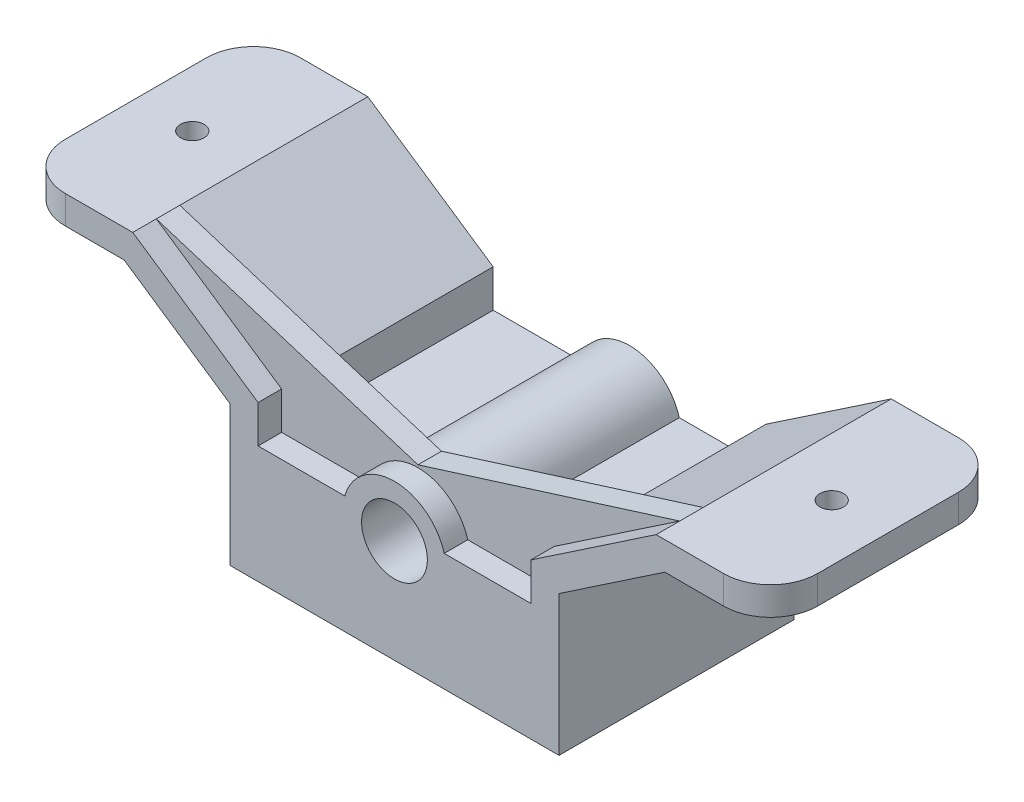
ISO-10303-21;
HEADER;
FILE_DESCRIPTION(('STEP AP214'),'2;1');
FILE_NAME('part.step','',(''),(''),'','','');
FILE_SCHEMA(('AUTOMOTIVE_DESIGN { 1 0 10303 214 1 1 1 1 }'));
ENDSEC;
DATA;
#1=APPLICATION_CONTEXT('core data for automotive mechanical design processes');
#2=APPLICATION_PROTOCOL_DEFINITION('international standard','automotive_design',2000,#1);
#3=PRODUCT_CONTEXT('',#1,'mechanical');
#4=PRODUCT('Part','Part','',(#3));
#5=PRODUCT_RELATED_PRODUCT_CATEGORY('part','',(#4));
#6=PRODUCT_DEFINITION_FORMATION('','',#4);
#7=PRODUCT_DEFINITION_CONTEXT('part definition',#1,'design');
#8=PRODUCT_DEFINITION('design','',#6,#7);
#9=PRODUCT_DEFINITION_SHAPE('','',#8);
#10=(LENGTH_UNIT() NAMED_UNIT(*) SI_UNIT(.MILLI.,.METRE.));
#11=(NAMED_UNIT(*) PLANE_ANGLE_UNIT() SI_UNIT($,.RADIAN.));
#12=(NAMED_UNIT(*) SI_UNIT($,.STERADIAN.) SOLID_ANGLE_UNIT());
#13=UNCERTAINTY_MEASURE_WITH_UNIT(LENGTH_MEASURE(1.E-05),#10,'distance_accuracy_value','');
#14=(GEOMETRIC_REPRESENTATION_CONTEXT(3) GLOBAL_UNCERTAINTY_ASSIGNED_CONTEXT((#13)) GLOBAL_UNIT_ASSIGNED_CONTEXT((#10,
#11,#12)) REPRESENTATION_CONTEXT('',''));
#15=CARTESIAN_POINT('',(0.,0.,0.));
#16=DIRECTION('',(0.,0.,1.));
#17=DIRECTION('',(1.,0.,0.));
#18=AXIS2_PLACEMENT_3D('',#15,#16,#17);
#19=CARTESIAN_POINT('',(55.664377375765,51.,25.));
#20=DIRECTION('',(0.55950585253942,-0.828826399781122,0.));
#21=DIRECTION('',(0.828826399781122,0.55950585253942,0.));
#22=AXIS2_PLACEMENT_3D('',#19,#20,#21);
#23=PLANE('',#22);
#24=DIRECTION('',(0.828826399781122,0.55950585253942,0.));
#25=VECTOR('',#24,1.);
#26=CARTESIAN_POINT('',(55.664377375765,51.,15.));
#27=LINE('',#26,#25);
#28=CARTESIAN_POINT('',(29.,33.,15.));
#29=VERTEX_POINT('',#28);
#30=CARTESIAN_POINT('',(55.664377375765,51.,15.));
#31=VERTEX_POINT('',#30);
#32=EDGE_CURVE('E260',#29,#31,#27,.T.);
#33=ORIENTED_EDGE('',*,*,#32,.T.);
#34=DIRECTION('',(0.,0.,-1.));
#35=VECTOR('',#34,1.);
#36=CARTESIAN_POINT('',(55.664377375765,51.,25.));
#37=LINE('',#36,#35);
#38=CARTESIAN_POINT('',(55.664377375765,51.,-25.));
#39=VERTEX_POINT('',#38);
#40=EDGE_CURVE('E499',#31,#39,#37,.T.);
#41=ORIENTED_EDGE('',*,*,#40,.T.);
#42=DIRECTION('',(-0.828826399781122,-0.55950585253942,0.));
#43=VECTOR('',#42,1.);
#44=CARTESIAN_POINT('',(55.664377375765,51.,-25.));
#45=LINE('',#44,#43);
#46=CARTESIAN_POINT('',(29.,33.,-25.));
#47=VERTEX_POINT('',#46);
#48=EDGE_CURVE('E405',#39,#47,#45,.T.);
#49=ORIENTED_EDGE('',*,*,#48,.T.);
#50=DIRECTION('',(0.,0.,-1.));
#51=VECTOR('',#50,1.);
#52=CARTESIAN_POINT('',(29.,33.,25.));
#53=LINE('',#52,#51);
#54=EDGE_CURVE('E494',#29,#47,#53,.T.);
#55=ORIENTED_EDGE('',*,*,#54,.F.);
#56=EDGE_LOOP('',(#33,#41,#49,#55));
#57=FACE_BOUND('',#56,.T.);
#58=ADVANCED_FACE('F45',(#57),#23,.F.);
#59=CARTESIAN_POINT('',(29.,33.,25.));
#60=DIRECTION('',(1.,0.,0.));
#61=DIRECTION('',(0.,0.,-1.));
#62=AXIS2_PLACEMENT_3D('',#59,#60,#61);
#63=PLANE('',#62);
#64=DIRECTION('',(0.,1.,0.));
#65=VECTOR('',#64,1.);
#66=CARTESIAN_POINT('',(29.,33.,15.));
#67=LINE('',#66,#65);
#68=CARTESIAN_POINT('',(29.,25.,15.));
#69=VERTEX_POINT('',#68);
#70=EDGE_CURVE('E304',#69,#29,#67,.T.);
#71=ORIENTED_EDGE('',*,*,#70,.T.);
#72=ORIENTED_EDGE('',*,*,#54,.T.);
#73=DIRECTION('',(0.,-1.,0.));
#74=VECTOR('',#73,1.);
#75=CARTESIAN_POINT('',(29.,33.,-25.));
#76=LINE('',#75,#74);
#77=CARTESIAN_POINT('',(29.,25.,-25.));
#78=VERTEX_POINT('',#77);
#79=EDGE_CURVE('E409',#47,#78,#76,.T.);
#80=ORIENTED_EDGE('',*,*,#79,.T.);
#81=DIRECTION('',(0.,0.,-1.));
#82=VECTOR('',#81,1.);
#83=CARTESIAN_POINT('',(29.,25.,25.));
#84=LINE('',#83,#82);
#85=EDGE_CURVE('E489',#69,#78,#84,.T.);
#86=ORIENTED_EDGE('',*,*,#85,.F.);
#87=EDGE_LOOP('',(#71,#72,#80,#86));
#88=FACE_BOUND('',#87,.T.);
#89=ADVANCED_FACE('F682',(#88),#63,.F.);
#90=CARTESIAN_POINT('',(29.,25.,25.));
#91=DIRECTION('',(0.,-1.,0.));
#92=DIRECTION('',(0.,0.,-1.));
#93=AXIS2_PLACEMENT_3D('',#90,#91,#92);
#94=PLANE('',#93);
#95=DIRECTION('',(1.,0.,0.));
#96=VECTOR('',#95,1.);
#97=CARTESIAN_POINT('',(29.,25.,15.));
#98=LINE('',#97,#96);
#99=CARTESIAN_POINT('',(10.5830052442584,25.,15.));
#100=VERTEX_POINT('',#99);
#101=EDGE_CURVE('E300',#100,#69,#98,.T.);
#102=ORIENTED_EDGE('',*,*,#101,.T.);
#103=ORIENTED_EDGE('',*,*,#85,.T.);
#104=DIRECTION('',(-1.,0.,0.));
#105=VECTOR('',#104,1.);
#106=CARTESIAN_POINT('',(29.,25.,-25.));
#107=LINE('',#106,#105);
#108=CARTESIAN_POINT('',(10.5830052442584,25.,-25.));
#109=VERTEX_POINT('',#108);
#110=EDGE_CURVE('E413',#78,#109,#107,.T.);
#111=ORIENTED_EDGE('',*,*,#110,.T.);
#112=DIRECTION('',(0.,0.,-1.));
#113=VECTOR('',#112,1.);
#114=CARTESIAN_POINT('',(10.5830052442584,25.,25.));
#115=LINE('',#114,#113);
#116=EDGE_CURVE('E484',#100,#109,#115,.T.);
#117=ORIENTED_EDGE('',*,*,#116,.F.);
#118=EDGE_LOOP('',(#102,#103,#111,#117));
#119=FACE_BOUND('',#118,.T.);
#120=ADVANCED_FACE('F691',(#119),#94,.F.);
#121=CARTESIAN_POINT('',(0.,22.,25.));
#122=DIRECTION('',(0.,0.,-1.));
#123=DIRECTION('',(-1.,0.,0.));
#124=AXIS2_PLACEMENT_3D('',#121,#122,#123);
#125=CYLINDRICAL_SURFACE('',#124,11.);
#126=CARTESIAN_POINT('',(0.,22.,15.));
#127=DIRECTION('',(0.,0.,-1.));
#128=DIRECTION('',(1.,0.,0.));
#129=AXIS2_PLACEMENT_3D('',#126,#127,#128);
#130=CIRCLE('',#129,11.);
#131=CARTESIAN_POINT('',(-10.5830052442584,25.,15.));
#132=VERTEX_POINT('',#131);
#133=EDGE_CURVE('E296',#132,#100,#130,.T.);
#134=ORIENTED_EDGE('',*,*,#133,.T.);
#135=ORIENTED_EDGE('',*,*,#116,.T.);
#136=CARTESIAN_POINT('',(0.,22.,-25.));
#137=DIRECTION('',(0.,0.,1.));
#138=DIRECTION('',(-1.,0.,0.));
#139=AXIS2_PLACEMENT_3D('',#136,#137,#138);
#140=CIRCLE('',#139,11.);
#141=CARTESIAN_POINT('',(-10.5830052442584,25.,-25.));
#142=VERTEX_POINT('',#141);
#143=EDGE_CURVE('E417',#109,#142,#140,.T.);
#144=ORIENTED_EDGE('',*,*,#143,.T.);
#145=DIRECTION('',(0.,0.,-1.));
#146=VECTOR('',#145,1.);
#147=CARTESIAN_POINT('',(-10.5830052442584,25.,25.));
#148=LINE('',#147,#146);
#149=EDGE_CURVE('E479',#132,#142,#148,.T.);
#150=ORIENTED_EDGE('',*,*,#149,.F.);
#151=EDGE_LOOP('',(#134,#135,#144,#150));
#152=FACE_BOUND('',#151,.T.);
#153=ADVANCED_FACE('F696',(#152),#125,.T.);
#154=CARTESIAN_POINT('',(-29.,25.,25.));
#155=DIRECTION('',(0.,-1.,0.));
#156=DIRECTION('',(0.,0.,-1.));
#157=AXIS2_PLACEMENT_3D('',#154,#155,#156);
#158=PLANE('',#157);
#159=DIRECTION('',(1.,0.,0.));
#160=VECTOR('',#159,1.);
#161=CARTESIAN_POINT('',(-10.5830052442584,25.,15.));
#162=LINE('',#161,#160);
#163=CARTESIAN_POINT('',(-29.,25.,15.));
#164=VERTEX_POINT('',#163);
#165=EDGE_CURVE('E292',#164,#132,#162,.T.);
#166=ORIENTED_EDGE('',*,*,#165,.T.);
#167=ORIENTED_EDGE('',*,*,#149,.T.);
#168=DIRECTION('',(-1.,0.,0.));
#169=VECTOR('',#168,1.);
#170=CARTESIAN_POINT('',(-29.,25.,-25.));
#171=LINE('',#170,#169);
#172=CARTESIAN_POINT('',(-29.,25.,-25.));
#173=VERTEX_POINT('',#172);
#174=EDGE_CURVE('E421',#142,#173,#171,.T.);
#175=ORIENTED_EDGE('',*,*,#174,.T.);
#176=DIRECTION('',(0.,0.,-1.));
#177=VECTOR('',#176,1.);
#178=CARTESIAN_POINT('',(-29.,25.,25.));
#179=LINE('',#178,#177);
#180=EDGE_CURVE('E474',#164,#173,#179,.T.);
#181=ORIENTED_EDGE('',*,*,#180,.F.);
#182=EDGE_LOOP('',(#166,#167,#175,#181));
#183=FACE_BOUND('',#182,.T.);
#184=ADVANCED_FACE('F705',(#183),#158,.F.);
#185=CARTESIAN_POINT('',(-29.,33.,25.));
#186=DIRECTION('',(-1.,0.,0.));
#187=DIRECTION('',(0.,0.,1.));
#188=AXIS2_PLACEMENT_3D('',#185,#186,#187);
#189=PLANE('',#188);
#190=DIRECTION('',(0.,-1.,0.));
#191=VECTOR('',#190,1.);
#192=CARTESIAN_POINT('',(-29.,25.,15.));
#193=LINE('',#192,#191);
#194=CARTESIAN_POINT('',(-29.,33.,15.));
#195=VERTEX_POINT('',#194);
#196=EDGE_CURVE('E288',#195,#164,#193,.T.);
#197=ORIENTED_EDGE('',*,*,#196,.T.);
#198=ORIENTED_EDGE('',*,*,#180,.T.);
#199=DIRECTION('',(0.,1.,0.));
#200=VECTOR('',#199,1.);
#201=CARTESIAN_POINT('',(-29.,33.,-25.));
#202=LINE('',#201,#200);
#203=CARTESIAN_POINT('',(-29.,33.,-25.));
#204=VERTEX_POINT('',#203);
#205=EDGE_CURVE('E425',#173,#204,#202,.T.);
#206=ORIENTED_EDGE('',*,*,#205,.T.);
#207=DIRECTION('',(0.,0.,-1.));
#208=VECTOR('',#207,1.);
#209=CARTESIAN_POINT('',(-29.,33.,25.));
#210=LINE('',#209,#208);
#211=EDGE_CURVE('E469',#195,#204,#210,.T.);
#212=ORIENTED_EDGE('',*,*,#211,.F.);
#213=EDGE_LOOP('',(#197,#198,#206,#212));
#214=FACE_BOUND('',#213,.T.);
#215=ADVANCED_FACE('F708',(#214),#189,.F.);
#216=CARTESIAN_POINT('',(-55.664377375765,51.,25.));
#217=DIRECTION('',(-0.55950585253942,-0.828826399781122,0.));
#218=DIRECTION('',(0.828826399781122,-0.55950585253942,0.));
#219=AXIS2_PLACEMENT_3D('',#216,#217,#218);
#220=PLANE('',#219);
#221=DIRECTION('',(0.828826399781122,-0.55950585253942,0.));
#222=VECTOR('',#221,1.);
#223=CARTESIAN_POINT('',(-29.,33.,15.));
#224=LINE('',#223,#222);
#225=CARTESIAN_POINT('',(-55.664377375765,51.,15.));
#226=VERTEX_POINT('',#225);
#227=EDGE_CURVE('E268',#226,#195,#224,.T.);
#228=ORIENTED_EDGE('',*,*,#227,.T.);
#229=ORIENTED_EDGE('',*,*,#211,.T.);
#230=DIRECTION('',(-0.828826399781122,0.55950585253942,0.));
#231=VECTOR('',#230,1.);
#232=CARTESIAN_POINT('',(-55.664377375765,51.,-25.));
#233=LINE('',#232,#231);
#234=CARTESIAN_POINT('',(-55.664377375765,51.,-25.));
#235=VERTEX_POINT('',#234);
#236=EDGE_CURVE('E429',#204,#235,#233,.T.);
#237=ORIENTED_EDGE('',*,*,#236,.T.);
#238=DIRECTION('',(0.,0.,-1.));
#239=VECTOR('',#238,1.);
#240=CARTESIAN_POINT('',(-55.664377375765,51.,25.));
#241=LINE('',#240,#239);
#242=EDGE_CURVE('E464',#226,#235,#241,.T.);
#243=ORIENTED_EDGE('',*,*,#242,.F.);
#244=EDGE_LOOP('',(#228,#229,#237,#243));
#245=FACE_BOUND('',#244,.T.);
#246=ADVANCED_FACE('F620',(#245),#220,.F.);
#247=CARTESIAN_POINT('',(-35.,0.,25.));
#248=DIRECTION('',(0.,1.,0.));
#249=DIRECTION('',(0.,0.,1.));
#250=AXIS2_PLACEMENT_3D('',#247,#248,#249);
#251=PLANE('',#250);
#252=DIRECTION('',(1.,0.,0.));
#253=VECTOR('',#252,1.);
#254=CARTESIAN_POINT('',(-35.,0.,-25.));
#255=LINE('',#254,#253);
#256=CARTESIAN_POINT('',(-35.,0.,-25.));
#257=VERTEX_POINT('',#256);
#258=CARTESIAN_POINT('',(35.,0.,-25.));
#259=VERTEX_POINT('',#258);
#260=EDGE_CURVE('E334',#257,#259,#255,.T.);
#261=ORIENTED_EDGE('',*,*,#260,.T.);
#262=DIRECTION('',(0.,0.,-1.));
#263=VECTOR('',#262,1.);
#264=CARTESIAN_POINT('',(35.,0.,25.));
#265=LINE('',#264,#263);
#266=CARTESIAN_POINT('',(35.,0.,25.));
#267=VERTEX_POINT('',#266);
#268=EDGE_CURVE('E519',#267,#259,#265,.T.);
#269=ORIENTED_EDGE('',*,*,#268,.F.);
#270=DIRECTION('',(1.,0.,0.));
#271=VECTOR('',#270,1.);
#272=CARTESIAN_POINT('',(-35.,0.,25.));
#273=LINE('',#272,#271);
#274=CARTESIAN_POINT('',(-35.,0.,25.));
#275=VERTEX_POINT('',#274);
#276=EDGE_CURVE('E337',#275,#267,#273,.T.);
#277=ORIENTED_EDGE('',*,*,#276,.F.);
#278=DIRECTION('',(0.,0.,-1.));
#279=VECTOR('',#278,1.);
#280=CARTESIAN_POINT('',(-35.,0.,25.));
#281=LINE('',#280,#279);
#282=EDGE_CURVE('E389',#275,#257,#281,.T.);
#283=ORIENTED_EDGE('',*,*,#282,.T.);
#284=EDGE_LOOP('',(#261,#269,#277,#283));
#285=FACE_BOUND('',#284,.T.);
#286=ADVANCED_FACE('F772',(#285),#251,.F.);
#287=CARTESIAN_POINT('',(35.,0.,25.));
#288=DIRECTION('',(-1.,0.,0.));
#289=DIRECTION('',(0.,0.,1.));
#290=AXIS2_PLACEMENT_3D('',#287,#288,#289);
#291=PLANE('',#290);
#292=DIRECTION('',(0.,1.,0.));
#293=VECTOR('',#292,1.);
#294=CARTESIAN_POINT('',(35.,0.,-25.));
#295=LINE('',#294,#293);
#296=CARTESIAN_POINT('',(35.,29.8111960653504,-25.));
#297=VERTEX_POINT('',#296);
#298=EDGE_CURVE('E393',#259,#297,#295,.T.);
#299=ORIENTED_EDGE('',*,*,#298,.T.);
#300=DIRECTION('',(0.,0.,-1.));
#301=VECTOR('',#300,1.);
#302=CARTESIAN_POINT('',(35.,29.8111960653504,25.));
#303=LINE('',#302,#301);
#304=CARTESIAN_POINT('',(35.,29.8111960653504,25.));
#305=VERTEX_POINT('',#304);
#306=EDGE_CURVE('E515',#305,#297,#303,.T.);
#307=ORIENTED_EDGE('',*,*,#306,.F.);
#308=DIRECTION('',(0.,1.,0.));
#309=VECTOR('',#308,1.);
#310=CARTESIAN_POINT('',(35.,0.,25.));
#311=LINE('',#310,#309);
#312=EDGE_CURVE('E341',#267,#305,#311,.T.);
#313=ORIENTED_EDGE('',*,*,#312,.F.);
#314=ORIENTED_EDGE('',*,*,#268,.T.);
#315=EDGE_LOOP('',(#299,#307,#313,#314));
#316=FACE_BOUND('',#315,.T.);
#317=ADVANCED_FACE('F775',(#316),#291,.F.);
#318=CARTESIAN_POINT('',(35.,29.8111960653504,25.));
#319=DIRECTION('',(-0.55950585253942,0.828826399781122,0.));
#320=DIRECTION('',(-0.828826399781122,-0.559505852539421,0.));
#321=AXIS2_PLACEMENT_3D('',#318,#319,#320);
#322=PLANE('',#321);
#323=DIRECTION('',(0.828826399781122,0.55950585253942,0.));
#324=VECTOR('',#323,1.);
#325=CARTESIAN_POINT('',(35.,29.8111960653504,-25.));
#326=LINE('',#325,#324);
#327=CARTESIAN_POINT('',(57.5,45.,-25.));
#328=VERTEX_POINT('',#327);
#329=EDGE_CURVE('E396',#297,#328,#326,.T.);
#330=ORIENTED_EDGE('',*,*,#329,.T.);
#331=DIRECTION('',(0.,0.,-1.));
#332=VECTOR('',#331,1.);
#333=CARTESIAN_POINT('',(57.5,45.,25.));
#334=LINE('',#333,#332);
#335=CARTESIAN_POINT('',(57.5,45.,25.));
#336=VERTEX_POINT('',#335);
#337=EDGE_CURVE('E511',#336,#328,#334,.T.);
#338=ORIENTED_EDGE('',*,*,#337,.F.);
#339=DIRECTION('',(0.828826399781122,0.55950585253942,0.));
#340=VECTOR('',#339,1.);
#341=CARTESIAN_POINT('',(35.,29.8111960653504,25.));
#342=LINE('',#341,#340);
#343=EDGE_CURVE('E345',#305,#336,#342,.T.);
#344=ORIENTED_EDGE('',*,*,#343,.F.);
#345=ORIENTED_EDGE('',*,*,#306,.T.);
#346=EDGE_LOOP('',(#330,#338,#344,#345));
#347=FACE_BOUND('',#346,.T.);
#348=ADVANCED_FACE('F778',(#347),#322,.F.);
#349=CARTESIAN_POINT('',(57.5,45.,25.));
#350=DIRECTION('',(0.,1.,0.));
#351=DIRECTION('',(0.,0.,1.));
#352=AXIS2_PLACEMENT_3D('',#349,#350,#351);
#353=PLANE('',#352);
#354=CARTESIAN_POINT('',(68.,45.,0.));
#355=DIRECTION('',(0.,1.,0.));
#356=DIRECTION('',(0.,0.,1.));
#357=AXIS2_PLACEMENT_3D('',#354,#355,#356);
#358=CIRCLE('',#357,2.50000000000001);
#359=CARTESIAN_POINT('',(68.,45.,2.50000000000001));
#360=VERTEX_POINT('',#359);
#361=EDGE_CURVE('E1027',#360,#360,#358,.T.);
#362=ORIENTED_EDGE('',*,*,#361,.T.);
#363=EDGE_LOOP('',(#362));
#364=FACE_BOUND('',#363,.T.);
#365=DIRECTION('',(1.,0.,0.));
#366=VECTOR('',#365,1.);
#367=CARTESIAN_POINT('',(57.5,45.,-25.));
#368=LINE('',#367,#366);
#369=CARTESIAN_POINT('',(70.,45.,-25.));
#370=VERTEX_POINT('',#369);
#371=EDGE_CURVE('E399',#328,#370,#368,.T.);
#372=ORIENTED_EDGE('',*,*,#371,.T.);
#373=CARTESIAN_POINT('',(70.,45.,-15.));
#374=DIRECTION('',(0.,1.,0.));
#375=DIRECTION('',(0.,0.,1.));
#376=AXIS2_PLACEMENT_3D('',#373,#374,#375);
#377=CIRCLE('',#376,10.);
#378=CARTESIAN_POINT('',(80.,45.,-15.));
#379=VERTEX_POINT('',#378);
#380=EDGE_CURVE('E11',#370,#379,#377,.F.);
#381=ORIENTED_EDGE('',*,*,#380,.T.);
#382=DIRECTION('',(0.,0.,-1.));
#383=VECTOR('',#382,1.);
#384=CARTESIAN_POINT('',(80.,45.,25.));
#385=LINE('',#384,#383);
#386=CARTESIAN_POINT('',(80.,45.,15.));
#387=VERTEX_POINT('',#386);
#388=EDGE_CURVE('E508',#387,#379,#385,.T.);
#389=ORIENTED_EDGE('',*,*,#388,.F.);
#390=CARTESIAN_POINT('',(70.,45.,15.));
#391=DIRECTION('',(0.,1.,0.));
#392=DIRECTION('',(0.,0.,1.));
#393=AXIS2_PLACEMENT_3D('',#390,#391,#392);
#394=CIRCLE('',#393,10.);
#395=CARTESIAN_POINT('',(70.,45.,25.));
#396=VERTEX_POINT('',#395);
#397=EDGE_CURVE('E54',#387,#396,#394,.F.);
#398=ORIENTED_EDGE('',*,*,#397,.T.);
#399=DIRECTION('',(1.,0.,0.));
#400=VECTOR('',#399,1.);
#401=CARTESIAN_POINT('',(57.5,45.,25.));
#402=LINE('',#401,#400);
#403=EDGE_CURVE('E348',#336,#396,#402,.T.);
#404=ORIENTED_EDGE('',*,*,#403,.F.);
#405=ORIENTED_EDGE('',*,*,#337,.T.);
#406=EDGE_LOOP('',(#372,#381,#389,#398,#404,#405));
#407=FACE_BOUND('',#406,.T.);
#408=ADVANCED_FACE('F576',(#364,#407),#353,.F.);
#409=CARTESIAN_POINT('',(80.,45.,25.));
#410=DIRECTION('',(-1.,0.,0.));
#411=DIRECTION('',(0.,-1.,0.));
#412=AXIS2_PLACEMENT_3D('',#409,#410,#411);
#413=PLANE('',#412);
#414=ORIENTED_EDGE('',*,*,#388,.T.);
#415=DIRECTION('',(0.,1.,0.));
#416=VECTOR('',#415,1.);
#417=CARTESIAN_POINT('',(80.,51.,-15.));
#418=LINE('',#417,#416);
#419=CARTESIAN_POINT('',(80.,51.,-15.));
#420=VERTEX_POINT('',#419);
#421=EDGE_CURVE('E564',#379,#420,#418,.T.);
#422=ORIENTED_EDGE('',*,*,#421,.T.);
#423=DIRECTION('',(0.,0.,-1.));
#424=VECTOR('',#423,1.);
#425=CARTESIAN_POINT('',(80.,51.,25.));
#426=LINE('',#425,#424);
#427=CARTESIAN_POINT('',(80.,51.,15.));
#428=VERTEX_POINT('',#427);
#429=EDGE_CURVE('E504',#428,#420,#426,.T.);
#430=ORIENTED_EDGE('',*,*,#429,.F.);
#431=DIRECTION('',(0.,1.,0.));
#432=VECTOR('',#431,1.);
#433=CARTESIAN_POINT('',(80.,45.,15.));
#434=LINE('',#433,#432);
#435=EDGE_CURVE('E66',#428,#387,#434,.F.);
#436=ORIENTED_EDGE('',*,*,#435,.T.);
#437=EDGE_LOOP('',(#414,#422,#430,#436));
#438=FACE_BOUND('',#437,.T.);
#439=ADVANCED_FACE('F587',(#438),#413,.F.);
#440=CARTESIAN_POINT('',(80.,51.,25.));
#441=DIRECTION('',(0.,-1.,0.));
#442=DIRECTION('',(0.,0.,-1.));
#443=AXIS2_PLACEMENT_3D('',#440,#441,#442);
#444=PLANE('',#443);
#445=CARTESIAN_POINT('',(68.,51.,0.));
#446=DIRECTION('',(0.,1.,0.));
#447=DIRECTION('',(0.,0.,1.));
#448=AXIS2_PLACEMENT_3D('',#445,#446,#447);
#449=CIRCLE('',#448,2.50000000000002);
#450=CARTESIAN_POINT('',(68.,51.,2.50000000000002));
#451=VERTEX_POINT('',#450);
#452=EDGE_CURVE('E528',#451,#451,#449,.T.);
#453=ORIENTED_EDGE('',*,*,#452,.F.);
#454=EDGE_LOOP('',(#453));
#455=FACE_BOUND('',#454,.T.);
#456=ORIENTED_EDGE('',*,*,#429,.T.);
#457=CARTESIAN_POINT('',(70.,51.,-15.));
#458=DIRECTION('',(0.,-1.,0.));
#459=DIRECTION('',(0.,0.,-1.));
#460=AXIS2_PLACEMENT_3D('',#457,#458,#459);
#461=CIRCLE('',#460,10.);
#462=CARTESIAN_POINT('',(70.,51.,-25.));
#463=VERTEX_POINT('',#462);
#464=EDGE_CURVE('E571',#420,#463,#461,.F.);
#465=ORIENTED_EDGE('',*,*,#464,.T.);
#466=DIRECTION('',(-1.,0.,0.));
#467=VECTOR('',#466,1.);
#468=CARTESIAN_POINT('',(80.,51.,-25.));
#469=LINE('',#468,#467);
#470=EDGE_CURVE('E402',#463,#39,#469,.T.);
#471=ORIENTED_EDGE('',*,*,#470,.T.);
#472=ORIENTED_EDGE('',*,*,#40,.F.);
#473=DIRECTION('',(0.,0.,1.));
#474=VECTOR('',#473,1.);
#475=CARTESIAN_POINT('',(55.664377375765,51.,15.));
#476=LINE('',#475,#474);
#477=CARTESIAN_POINT('',(55.664377375765,51.,20.));
#478=VERTEX_POINT('',#477);
#479=EDGE_CURVE('E274',#31,#478,#476,.T.);
#480=ORIENTED_EDGE('',*,*,#479,.T.);
#481=CARTESIAN_POINT('',(55.664377375765,51.,25.));
#482=VERTEX_POINT('',#481);
#483=EDGE_CURVE('E500',#482,#478,#37,.T.);
#484=ORIENTED_EDGE('',*,*,#483,.F.);
#485=DIRECTION('',(-1.,0.,0.));
#486=VECTOR('',#485,1.);
#487=CARTESIAN_POINT('',(80.,51.,25.));
#488=LINE('',#487,#486);
#489=CARTESIAN_POINT('',(70.,51.,25.));
#490=VERTEX_POINT('',#489);
#491=EDGE_CURVE('E352',#490,#482,#488,.T.);
#492=ORIENTED_EDGE('',*,*,#491,.F.);
#493=CARTESIAN_POINT('',(70.,51.,15.));
#494=DIRECTION('',(0.,-1.,0.));
#495=DIRECTION('',(0.,0.,-1.));
#496=AXIS2_PLACEMENT_3D('',#493,#494,#495);
#497=CIRCLE('',#496,10.);
#498=EDGE_CURVE('E568',#490,#428,#497,.F.);
#499=ORIENTED_EDGE('',*,*,#498,.T.);
#500=EDGE_LOOP('',(#456,#465,#471,#472,#480,#484,#492,#499));
#501=FACE_BOUND('',#500,.T.);
#502=ADVANCED_FACE('F585',(#455,#501),#444,.F.);
#503=ORIENTED_EDGE('',*,*,#483,.T.);
#504=DIRECTION('',(0.828826399781122,0.55950585253942,0.));
#505=VECTOR('',#504,1.);
#506=CARTESIAN_POINT('',(55.664377375765,51.,20.));
#507=LINE('',#506,#505);
#508=CARTESIAN_POINT('',(29.,33.,20.));
#509=VERTEX_POINT('',#508);
#510=EDGE_CURVE('E276',#509,#478,#507,.T.);
#511=ORIENTED_EDGE('',*,*,#510,.F.);
#512=CARTESIAN_POINT('',(29.,33.,25.));
#513=VERTEX_POINT('',#512);
#514=EDGE_CURVE('E495',#513,#509,#53,.T.);
#515=ORIENTED_EDGE('',*,*,#514,.F.);
#516=DIRECTION('',(-0.828826399781122,-0.55950585253942,0.));
#517=VECTOR('',#516,1.);
#518=CARTESIAN_POINT('',(55.664377375765,51.,25.));
#519=LINE('',#518,#517);
#520=EDGE_CURVE('E355',#482,#513,#519,.T.);
#521=ORIENTED_EDGE('',*,*,#520,.F.);
#522=EDGE_LOOP('',(#503,#511,#515,#521));
#523=FACE_BOUND('',#522,.T.);
#524=ADVANCED_FACE('F674',(#523),#23,.F.);
#525=ORIENTED_EDGE('',*,*,#514,.T.);
#526=DIRECTION('',(0.,1.,0.));
#527=VECTOR('',#526,1.);
#528=CARTESIAN_POINT('',(29.,33.,20.));
#529=LINE('',#528,#527);
#530=CARTESIAN_POINT('',(29.,25.,20.));
#531=VERTEX_POINT('',#530);
#532=EDGE_CURVE('E280',#531,#509,#529,.T.);
#533=ORIENTED_EDGE('',*,*,#532,.F.);
#534=CARTESIAN_POINT('',(29.,25.,25.));
#535=VERTEX_POINT('',#534);
#536=EDGE_CURVE('E490',#535,#531,#84,.T.);
#537=ORIENTED_EDGE('',*,*,#536,.F.);
#538=DIRECTION('',(0.,-1.,0.));
#539=VECTOR('',#538,1.);
#540=CARTESIAN_POINT('',(29.,33.,25.));
#541=LINE('',#540,#539);
#542=EDGE_CURVE('E358',#513,#535,#541,.T.);
#543=ORIENTED_EDGE('',*,*,#542,.F.);
#544=EDGE_LOOP('',(#525,#533,#537,#543));
#545=FACE_BOUND('',#544,.T.);
#546=ADVANCED_FACE('F669',(#545),#63,.F.);
#547=ORIENTED_EDGE('',*,*,#536,.T.);
#548=DIRECTION('',(1.,0.,0.));
#549=VECTOR('',#548,1.);
#550=CARTESIAN_POINT('',(29.,25.,20.));
#551=LINE('',#550,#549);
#552=CARTESIAN_POINT('',(10.5830052442584,25.,20.));
#553=VERTEX_POINT('',#552);
#554=EDGE_CURVE('E327',#553,#531,#551,.T.);
#555=ORIENTED_EDGE('',*,*,#554,.F.);
#556=CARTESIAN_POINT('',(10.5830052442584,25.,25.));
#557=VERTEX_POINT('',#556);
#558=EDGE_CURVE('E485',#557,#553,#115,.T.);
#559=ORIENTED_EDGE('',*,*,#558,.F.);
#560=DIRECTION('',(-1.,0.,0.));
#561=VECTOR('',#560,1.);
#562=CARTESIAN_POINT('',(29.,25.,25.));
#563=LINE('',#562,#561);
#564=EDGE_CURVE('E361',#535,#557,#563,.T.);
#565=ORIENTED_EDGE('',*,*,#564,.F.);
#566=EDGE_LOOP('',(#547,#555,#559,#565));
#567=FACE_BOUND('',#566,.T.);
#568=ADVANCED_FACE('F664',(#567),#94,.F.);
#569=ORIENTED_EDGE('',*,*,#558,.T.);
#570=CARTESIAN_POINT('',(0.,22.,20.));
#571=DIRECTION('',(0.,0.,-1.));
#572=DIRECTION('',(1.,0.,0.));
#573=AXIS2_PLACEMENT_3D('',#570,#571,#572);
#574=CIRCLE('',#573,11.);
#575=CARTESIAN_POINT('',(-10.5830052442584,25.,20.));
#576=VERTEX_POINT('',#575);
#577=EDGE_CURVE('E324',#576,#553,#574,.T.);
#578=ORIENTED_EDGE('',*,*,#577,.F.);
#579=CARTESIAN_POINT('',(-10.5830052442584,25.,25.));
#580=VERTEX_POINT('',#579);
#581=EDGE_CURVE('E480',#580,#576,#148,.T.);
#582=ORIENTED_EDGE('',*,*,#581,.F.);
#583=CARTESIAN_POINT('',(0.,22.,25.));
#584=DIRECTION('',(0.,0.,1.));
#585=DIRECTION('',(-1.,0.,0.));
#586=AXIS2_PLACEMENT_3D('',#583,#584,#585);
#587=CIRCLE('',#586,11.);
#588=EDGE_CURVE('E364',#557,#580,#587,.T.);
#589=ORIENTED_EDGE('',*,*,#588,.F.);
#590=EDGE_LOOP('',(#569,#578,#582,#589));
#591=FACE_BOUND('',#590,.T.);
#592=ADVANCED_FACE('F659',(#591),#125,.T.);
#593=ORIENTED_EDGE('',*,*,#581,.T.);
#594=DIRECTION('',(1.,0.,0.));
#595=VECTOR('',#594,1.);
#596=CARTESIAN_POINT('',(-10.5830052442584,25.,20.));
#597=LINE('',#596,#595);
#598=CARTESIAN_POINT('',(-29.,25.,20.));
#599=VERTEX_POINT('',#598);
#600=EDGE_CURVE('E321',#599,#576,#597,.T.);
#601=ORIENTED_EDGE('',*,*,#600,.F.);
#602=CARTESIAN_POINT('',(-29.,25.,25.));
#603=VERTEX_POINT('',#602);
#604=EDGE_CURVE('E475',#603,#599,#179,.T.);
#605=ORIENTED_EDGE('',*,*,#604,.F.);
#606=DIRECTION('',(-1.,0.,0.));
#607=VECTOR('',#606,1.);
#608=CARTESIAN_POINT('',(-29.,25.,25.));
#609=LINE('',#608,#607);
#610=EDGE_CURVE('E367',#580,#603,#609,.T.);
#611=ORIENTED_EDGE('',*,*,#610,.F.);
#612=EDGE_LOOP('',(#593,#601,#605,#611));
#613=FACE_BOUND('',#612,.T.);
#614=ADVANCED_FACE('F654',(#613),#158,.F.);
#615=ORIENTED_EDGE('',*,*,#604,.T.);
#616=DIRECTION('',(0.,-1.,0.));
#617=VECTOR('',#616,1.);
#618=CARTESIAN_POINT('',(-29.,25.,20.));
#619=LINE('',#618,#617);
#620=CARTESIAN_POINT('',(-29.,33.,20.));
#621=VERTEX_POINT('',#620);
#622=EDGE_CURVE('E318',#621,#599,#619,.T.);
#623=ORIENTED_EDGE('',*,*,#622,.F.);
#624=CARTESIAN_POINT('',(-29.,33.,25.));
#625=VERTEX_POINT('',#624);
#626=EDGE_CURVE('E470',#625,#621,#210,.T.);
#627=ORIENTED_EDGE('',*,*,#626,.F.);
#628=DIRECTION('',(0.,1.,0.));
#629=VECTOR('',#628,1.);
#630=CARTESIAN_POINT('',(-29.,33.,25.));
#631=LINE('',#630,#629);
#632=EDGE_CURVE('E370',#603,#625,#631,.T.);
#633=ORIENTED_EDGE('',*,*,#632,.F.);
#634=EDGE_LOOP('',(#615,#623,#627,#633));
#635=FACE_BOUND('',#634,.T.);
#636=ADVANCED_FACE('F650',(#635),#189,.F.);
#637=ORIENTED_EDGE('',*,*,#626,.T.);
#638=DIRECTION('',(0.828826399781122,-0.55950585253942,0.));
#639=VECTOR('',#638,1.);
#640=CARTESIAN_POINT('',(-29.,33.,20.));
#641=LINE('',#640,#639);
#642=CARTESIAN_POINT('',(-55.664377375765,51.,20.));
#643=VERTEX_POINT('',#642);
#644=EDGE_CURVE('E315',#643,#621,#641,.T.);
#645=ORIENTED_EDGE('',*,*,#644,.F.);
#646=CARTESIAN_POINT('',(-55.664377375765,51.,25.));
#647=VERTEX_POINT('',#646);
#648=EDGE_CURVE('E465',#647,#643,#241,.T.);
#649=ORIENTED_EDGE('',*,*,#648,.F.);
#650=DIRECTION('',(-0.828826399781122,0.55950585253942,0.));
#651=VECTOR('',#650,1.);
#652=CARTESIAN_POINT('',(-55.664377375765,51.,25.));
#653=LINE('',#652,#651);
#654=EDGE_CURVE('E373',#625,#647,#653,.T.);
#655=ORIENTED_EDGE('',*,*,#654,.F.);
#656=EDGE_LOOP('',(#637,#645,#649,#655));
#657=FACE_BOUND('',#656,.T.);
#658=ADVANCED_FACE('F644',(#657),#220,.F.);
#659=CARTESIAN_POINT('',(-80.,51.,25.));
#660=DIRECTION('',(0.,-1.,0.));
#661=DIRECTION('',(0.,0.,-1.));
#662=AXIS2_PLACEMENT_3D('',#659,#660,#661);
#663=PLANE('',#662);
#664=CARTESIAN_POINT('',(-68.,51.,0.));
#665=DIRECTION('',(0.,1.,0.));
#666=DIRECTION('',(0.,0.,1.));
#667=AXIS2_PLACEMENT_3D('',#664,#665,#666);
#668=CIRCLE('',#667,2.50000000000002);
#669=CARTESIAN_POINT('',(-68.,51.,2.50000000000002));
#670=VERTEX_POINT('',#669);
#671=EDGE_CURVE('E529',#670,#670,#668,.T.);
#672=ORIENTED_EDGE('',*,*,#671,.F.);
#673=EDGE_LOOP('',(#672));
#674=FACE_BOUND('',#673,.T.);
#675=DIRECTION('',(0.,0.,-1.));
#676=VECTOR('',#675,1.);
#677=CARTESIAN_POINT('',(-80.,51.,25.));
#678=LINE('',#677,#676);
#679=CARTESIAN_POINT('',(-80.,51.,15.));
#680=VERTEX_POINT('',#679);
#681=CARTESIAN_POINT('',(-80.,51.,-15.));
#682=VERTEX_POINT('',#681);
#683=EDGE_CURVE('E460',#680,#682,#678,.T.);
#684=ORIENTED_EDGE('',*,*,#683,.F.);
#685=CARTESIAN_POINT('',(-70.,51.,15.));
#686=DIRECTION('',(0.,-1.,0.));
#687=DIRECTION('',(0.,0.,-1.));
#688=AXIS2_PLACEMENT_3D('',#685,#686,#687);
#689=CIRCLE('',#688,10.);
#690=CARTESIAN_POINT('',(-70.,51.,25.));
#691=VERTEX_POINT('',#690);
#692=EDGE_CURVE('E553',#680,#691,#689,.F.);
#693=ORIENTED_EDGE('',*,*,#692,.T.);
#694=DIRECTION('',(-1.,0.,0.));
#695=VECTOR('',#694,1.);
#696=CARTESIAN_POINT('',(-80.,51.,25.));
#697=LINE('',#696,#695);
#698=EDGE_CURVE('E376',#647,#691,#697,.T.);
#699=ORIENTED_EDGE('',*,*,#698,.F.);
#700=ORIENTED_EDGE('',*,*,#648,.T.);
#701=DIRECTION('',(0.,0.,1.));
#702=VECTOR('',#701,1.);
#703=CARTESIAN_POINT('',(-55.664377375765,51.,15.));
#704=LINE('',#703,#702);
#705=EDGE_CURVE('E259',#226,#643,#704,.T.);
#706=ORIENTED_EDGE('',*,*,#705,.F.);
#707=ORIENTED_EDGE('',*,*,#242,.T.);
#708=DIRECTION('',(-1.,0.,0.));
#709=VECTOR('',#708,1.);
#710=CARTESIAN_POINT('',(-80.,51.,-25.));
#711=LINE('',#710,#709);
#712=CARTESIAN_POINT('',(-70.,51.,-25.));
#713=VERTEX_POINT('',#712);
#714=EDGE_CURVE('E433',#235,#713,#711,.T.);
#715=ORIENTED_EDGE('',*,*,#714,.T.);
#716=CARTESIAN_POINT('',(-70.,51.,-15.));
#717=DIRECTION('',(0.,-1.,0.));
#718=DIRECTION('',(0.,0.,-1.));
#719=AXIS2_PLACEMENT_3D('',#716,#717,#718);
#720=CIRCLE('',#719,10.);
#721=EDGE_CURVE('E550',#713,#682,#720,.F.);
#722=ORIENTED_EDGE('',*,*,#721,.T.);
#723=EDGE_LOOP('',(#684,#693,#699,#700,#706,#707,#715,#722));
#724=FACE_BOUND('',#723,.T.);
#725=ADVANCED_FACE('F615',(#674,#724),#663,.F.);
#726=CARTESIAN_POINT('',(-80.,45.,25.));
#727=DIRECTION('',(1.,0.,0.));
#728=DIRECTION('',(0.,1.,0.));
#729=AXIS2_PLACEMENT_3D('',#726,#727,#728);
#730=PLANE('',#729);
#731=DIRECTION('',(0.,0.,-1.));
#732=VECTOR('',#731,1.);
#733=CARTESIAN_POINT('',(-80.,45.,25.));
#734=LINE('',#733,#732);
#735=CARTESIAN_POINT('',(-80.,45.,15.));
#736=VERTEX_POINT('',#735);
#737=CARTESIAN_POINT('',(-80.,45.,-15.));
#738=VERTEX_POINT('',#737);
#739=EDGE_CURVE('E456',#736,#738,#734,.T.);
#740=ORIENTED_EDGE('',*,*,#739,.F.);
#741=DIRECTION('',(0.,-1.,0.));
#742=VECTOR('',#741,1.);
#743=CARTESIAN_POINT('',(-80.,45.,15.));
#744=LINE('',#743,#742);
#745=EDGE_CURVE('E547',#736,#680,#744,.F.);
#746=ORIENTED_EDGE('',*,*,#745,.T.);
#747=ORIENTED_EDGE('',*,*,#683,.T.);
#748=DIRECTION('',(0.,-1.,0.));
#749=VECTOR('',#748,1.);
#750=CARTESIAN_POINT('',(-80.,45.,-15.));
#751=LINE('',#750,#749);
#752=EDGE_CURVE('E543',#682,#738,#751,.T.);
#753=ORIENTED_EDGE('',*,*,#752,.T.);
#754=EDGE_LOOP('',(#740,#746,#747,#753));
#755=FACE_BOUND('',#754,.T.);
#756=ADVANCED_FACE('F631',(#755),#730,.F.);
#757=CARTESIAN_POINT('',(-57.5,45.,25.));
#758=DIRECTION('',(0.,1.,0.));
#759=DIRECTION('',(0.,0.,1.));
#760=AXIS2_PLACEMENT_3D('',#757,#758,#759);
#761=PLANE('',#760);
#762=CARTESIAN_POINT('',(-68.,45.,0.));
#763=DIRECTION('',(0.,1.,0.));
#764=DIRECTION('',(0.,0.,1.));
#765=AXIS2_PLACEMENT_3D('',#762,#763,#764);
#766=CIRCLE('',#765,2.50000000000001);
#767=CARTESIAN_POINT('',(-68.,45.,2.50000000000001));
#768=VERTEX_POINT('',#767);
#769=EDGE_CURVE('E524',#768,#768,#766,.T.);
#770=ORIENTED_EDGE('',*,*,#769,.T.);
#771=EDGE_LOOP('',(#770));
#772=FACE_BOUND('',#771,.T.);
#773=DIRECTION('',(1.,0.,0.));
#774=VECTOR('',#773,1.);
#775=CARTESIAN_POINT('',(-57.5,45.,25.));
#776=LINE('',#775,#774);
#777=CARTESIAN_POINT('',(-70.,45.,25.));
#778=VERTEX_POINT('',#777);
#779=CARTESIAN_POINT('',(-57.5,45.,25.));
#780=VERTEX_POINT('',#779);
#781=EDGE_CURVE('E380',#778,#780,#776,.T.);
#782=ORIENTED_EDGE('',*,*,#781,.F.);
#783=CARTESIAN_POINT('',(-70.,45.,15.));
#784=DIRECTION('',(0.,1.,0.));
#785=DIRECTION('',(0.,0.,1.));
#786=AXIS2_PLACEMENT_3D('',#783,#784,#785);
#787=CIRCLE('',#786,10.);
#788=EDGE_CURVE('E540',#778,#736,#787,.F.);
#789=ORIENTED_EDGE('',*,*,#788,.T.);
#790=ORIENTED_EDGE('',*,*,#739,.T.);
#791=CARTESIAN_POINT('',(-70.,45.,-15.));
#792=DIRECTION('',(0.,1.,0.));
#793=DIRECTION('',(0.,0.,1.));
#794=AXIS2_PLACEMENT_3D('',#791,#792,#793);
#795=CIRCLE('',#794,10.);
#796=CARTESIAN_POINT('',(-70.,45.,-25.));
#797=VERTEX_POINT('',#796);
#798=EDGE_CURVE('E537',#738,#797,#795,.F.);
#799=ORIENTED_EDGE('',*,*,#798,.T.);
#800=DIRECTION('',(1.,0.,0.));
#801=VECTOR('',#800,1.);
#802=CARTESIAN_POINT('',(-57.5,45.,-25.));
#803=LINE('',#802,#801);
#804=CARTESIAN_POINT('',(-57.5,45.,-25.));
#805=VERTEX_POINT('',#804);
#806=EDGE_CURVE('E437',#797,#805,#803,.T.);
#807=ORIENTED_EDGE('',*,*,#806,.T.);
#808=DIRECTION('',(0.,0.,-1.));
#809=VECTOR('',#808,1.);
#810=CARTESIAN_POINT('',(-57.5,45.,25.));
#811=LINE('',#810,#809);
#812=EDGE_CURVE('E452',#780,#805,#811,.T.);
#813=ORIENTED_EDGE('',*,*,#812,.F.);
#814=EDGE_LOOP('',(#782,#789,#790,#799,#807,#813));
#815=FACE_BOUND('',#814,.T.);
#816=ADVANCED_FACE('F716',(#772,#815),#761,.F.);
#817=CARTESIAN_POINT('',(-35.,29.8111960653504,25.));
#818=DIRECTION('',(0.55950585253942,0.828826399781122,0.));
#819=DIRECTION('',(-0.828826399781122,0.559505852539421,0.));
#820=AXIS2_PLACEMENT_3D('',#817,#818,#819);
#821=PLANE('',#820);
#822=DIRECTION('',(0.828826399781122,-0.55950585253942,0.));
#823=VECTOR('',#822,1.);
#824=CARTESIAN_POINT('',(-35.,29.8111960653504,-25.));
#825=LINE('',#824,#823);
#826=CARTESIAN_POINT('',(-35.,29.8111960653504,-25.));
#827=VERTEX_POINT('',#826);
#828=EDGE_CURVE('E440',#805,#827,#825,.T.);
#829=ORIENTED_EDGE('',*,*,#828,.T.);
#830=DIRECTION('',(0.,0.,-1.));
#831=VECTOR('',#830,1.);
#832=CARTESIAN_POINT('',(-35.,29.8111960653504,25.));
#833=LINE('',#832,#831);
#834=CARTESIAN_POINT('',(-35.,29.8111960653504,25.));
#835=VERTEX_POINT('',#834);
#836=EDGE_CURVE('E448',#835,#827,#833,.T.);
#837=ORIENTED_EDGE('',*,*,#836,.F.);
#838=DIRECTION('',(0.828826399781122,-0.55950585253942,0.));
#839=VECTOR('',#838,1.);
#840=CARTESIAN_POINT('',(-35.,29.8111960653504,25.));
#841=LINE('',#840,#839);
#842=EDGE_CURVE('E383',#780,#835,#841,.T.);
#843=ORIENTED_EDGE('',*,*,#842,.F.);
#844=ORIENTED_EDGE('',*,*,#812,.T.);
#845=EDGE_LOOP('',(#829,#837,#843,#844));
#846=FACE_BOUND('',#845,.T.);
#847=ADVANCED_FACE('F719',(#846),#821,.F.);
#848=CARTESIAN_POINT('',(-35.,0.,25.));
#849=DIRECTION('',(1.,0.,0.));
#850=DIRECTION('',(0.,0.,-1.));
#851=AXIS2_PLACEMENT_3D('',#848,#849,#850);
#852=PLANE('',#851);
#853=DIRECTION('',(0.,-1.,0.));
#854=VECTOR('',#853,1.);
#855=CARTESIAN_POINT('',(-35.,0.,-25.));
#856=LINE('',#855,#854);
#857=EDGE_CURVE('E342',#827,#257,#856,.T.);
#858=ORIENTED_EDGE('',*,*,#857,.T.);
#859=ORIENTED_EDGE('',*,*,#282,.F.);
#860=DIRECTION('',(0.,-1.,0.));
#861=VECTOR('',#860,1.);
#862=CARTESIAN_POINT('',(-35.,0.,25.));
#863=LINE('',#862,#861);
#864=EDGE_CURVE('E386',#835,#275,#863,.T.);
#865=ORIENTED_EDGE('',*,*,#864,.F.);
#866=ORIENTED_EDGE('',*,*,#836,.T.);
#867=EDGE_LOOP('',(#858,#859,#865,#866));
#868=FACE_BOUND('',#867,.T.);
#869=ADVANCED_FACE('F723',(#868),#852,.F.);
#870=CARTESIAN_POINT('',(0.,22.,25.));
#871=DIRECTION('',(0.,0.,-1.));
#872=DIRECTION('',(-1.,0.,0.));
#873=AXIS2_PLACEMENT_3D('',#870,#871,#872);
#874=PLANE('',#873);
#875=CARTESIAN_POINT('',(0.,22.,25.));
#876=DIRECTION('',(0.,0.,1.));
#877=DIRECTION('',(1.,0.,0.));
#878=AXIS2_PLACEMENT_3D('',#875,#876,#877);
#879=CIRCLE('',#878,7.00000000000001);
#880=CARTESIAN_POINT('',(7.00000000000001,22.,25.));
#881=VERTEX_POINT('',#880);
#882=EDGE_CURVE('E1030',#881,#881,#879,.T.);
#883=ORIENTED_EDGE('',*,*,#882,.F.);
#884=EDGE_LOOP('',(#883));
#885=FACE_BOUND('',#884,.T.);
#886=ORIENTED_EDGE('',*,*,#698,.T.);
#887=DIRECTION('',(0.,-1.,0.));
#888=VECTOR('',#887,1.);
#889=CARTESIAN_POINT('',(-69.9999999999999,21.9999999999998,25.));
#890=LINE('',#889,#888);
#891=EDGE_CURVE('E533',#691,#778,#890,.T.);
#892=ORIENTED_EDGE('',*,*,#891,.T.);
#893=ORIENTED_EDGE('',*,*,#781,.T.);
#894=ORIENTED_EDGE('',*,*,#842,.T.);
#895=ORIENTED_EDGE('',*,*,#864,.T.);
#896=ORIENTED_EDGE('',*,*,#276,.T.);
#897=ORIENTED_EDGE('',*,*,#312,.T.);
#898=ORIENTED_EDGE('',*,*,#343,.T.);
#899=ORIENTED_EDGE('',*,*,#403,.T.);
#900=DIRECTION('',(0.,1.,0.));
#901=VECTOR('',#900,1.);
#902=CARTESIAN_POINT('',(69.9999999999999,21.9999999999998,25.));
#903=LINE('',#902,#901);
#904=EDGE_CURVE('E523',#396,#490,#903,.T.);
#905=ORIENTED_EDGE('',*,*,#904,.T.);
#906=ORIENTED_EDGE('',*,*,#491,.T.);
#907=ORIENTED_EDGE('',*,*,#520,.T.);
#908=ORIENTED_EDGE('',*,*,#542,.T.);
#909=ORIENTED_EDGE('',*,*,#564,.T.);
#910=ORIENTED_EDGE('',*,*,#588,.T.);
#911=ORIENTED_EDGE('',*,*,#610,.T.);
#912=ORIENTED_EDGE('',*,*,#632,.T.);
#913=ORIENTED_EDGE('',*,*,#654,.T.);
#914=EDGE_LOOP('',(#886,#892,#893,#894,#895,#896,#897,#898,#899,#905,#906,#907,#908,#909,#910,
#911,#912,#913));
#915=FACE_BOUND('',#914,.T.);
#916=ADVANCED_FACE('F580',(#885,#915),#874,.F.);
#917=CARTESIAN_POINT('',(0.,22.,-25.));
#918=DIRECTION('',(0.,0.,-1.));
#919=DIRECTION('',(-1.,0.,0.));
#920=AXIS2_PLACEMENT_3D('',#917,#918,#919);
#921=PLANE('',#920);
#922=CARTESIAN_POINT('',(0.,22.,-25.));
#923=DIRECTION('',(0.,0.,1.));
#924=DIRECTION('',(1.,0.,0.));
#925=AXIS2_PLACEMENT_3D('',#922,#923,#924);
#926=CIRCLE('',#925,7.00000000000001);
#927=CARTESIAN_POINT('',(7.00000000000001,22.,-25.));
#928=VERTEX_POINT('',#927);
#929=EDGE_CURVE('E283',#928,#928,#926,.T.);
#930=ORIENTED_EDGE('',*,*,#929,.T.);
#931=EDGE_LOOP('',(#930));
#932=FACE_BOUND('',#931,.T.);
#933=ORIENTED_EDGE('',*,*,#806,.F.);
#934=DIRECTION('',(0.,-1.,0.));
#935=VECTOR('',#934,1.);
#936=CARTESIAN_POINT('',(-70.,51.,-25.));
#937=LINE('',#936,#935);
#938=EDGE_CURVE('E559',#797,#713,#937,.F.);
#939=ORIENTED_EDGE('',*,*,#938,.T.);
#940=ORIENTED_EDGE('',*,*,#714,.F.);
#941=ORIENTED_EDGE('',*,*,#236,.F.);
#942=ORIENTED_EDGE('',*,*,#205,.F.);
#943=ORIENTED_EDGE('',*,*,#174,.F.);
#944=ORIENTED_EDGE('',*,*,#143,.F.);
#945=ORIENTED_EDGE('',*,*,#110,.F.);
#946=ORIENTED_EDGE('',*,*,#79,.F.);
#947=ORIENTED_EDGE('',*,*,#48,.F.);
#948=ORIENTED_EDGE('',*,*,#470,.F.);
#949=DIRECTION('',(0.,1.,0.));
#950=VECTOR('',#949,1.);
#951=CARTESIAN_POINT('',(70.,45.,-25.));
#952=LINE('',#951,#950);
#953=EDGE_CURVE('E556',#463,#370,#952,.F.);
#954=ORIENTED_EDGE('',*,*,#953,.T.);
#955=ORIENTED_EDGE('',*,*,#371,.F.);
#956=ORIENTED_EDGE('',*,*,#329,.F.);
#957=ORIENTED_EDGE('',*,*,#298,.F.);
#958=ORIENTED_EDGE('',*,*,#260,.F.);
#959=ORIENTED_EDGE('',*,*,#857,.F.);
#960=ORIENTED_EDGE('',*,*,#828,.F.);
#961=EDGE_LOOP('',(#933,#939,#940,#941,#942,#943,#944,#945,#946,#947,#948,#954,#955,#956,#957,
#958,#959,#960));
#962=FACE_BOUND('',#961,.T.);
#963=ADVANCED_FACE('F598',(#932,#962),#921,.T.);
#964=CARTESIAN_POINT('',(55.664377375765,51.,15.));
#965=DIRECTION('',(-0.299458492496793,0.95410932878342,0.));
#966=DIRECTION('',(-0.95410932878342,-0.299458492496793,0.));
#967=AXIS2_PLACEMENT_3D('',#964,#965,#966);
#968=PLANE('',#967);
#969=DIRECTION('',(-0.95410932878342,-0.299458492496793,0.));
#970=VECTOR('',#969,1.);
#971=CARTESIAN_POINT('',(55.664377375765,51.,20.));
#972=LINE('',#971,#970);
#973=CARTESIAN_POINT('',(0.,33.5290770859835,20.));
#974=VERTEX_POINT('',#973);
#975=EDGE_CURVE('E310',#478,#974,#972,.T.);
#976=ORIENTED_EDGE('',*,*,#975,.F.);
#977=ORIENTED_EDGE('',*,*,#479,.F.);
#978=DIRECTION('',(-0.95410932878342,-0.299458492496793,0.));
#979=VECTOR('',#978,1.);
#980=CARTESIAN_POINT('',(55.664377375765,51.,15.));
#981=LINE('',#980,#979);
#982=CARTESIAN_POINT('',(0.,33.5290770859835,15.));
#983=VERTEX_POINT('',#982);
#984=EDGE_CURVE('E265',#31,#983,#981,.T.);
#985=ORIENTED_EDGE('',*,*,#984,.T.);
#986=DIRECTION('',(0.,0.,1.));
#987=VECTOR('',#986,1.);
#988=CARTESIAN_POINT('',(0.,33.5290770859835,15.));
#989=LINE('',#988,#987);
#990=EDGE_CURVE('E248',#983,#974,#989,.T.);
#991=ORIENTED_EDGE('',*,*,#990,.T.);
#992=EDGE_LOOP('',(#976,#977,#985,#991));
#993=FACE_BOUND('',#992,.T.);
#994=ADVANCED_FACE('F272',(#993),#968,.T.);
#995=CARTESIAN_POINT('',(-55.664377375765,51.,15.));
#996=DIRECTION('',(0.299458492496793,0.95410932878342,0.));
#997=DIRECTION('',(-0.95410932878342,0.299458492496793,0.));
#998=AXIS2_PLACEMENT_3D('',#995,#996,#997);
#999=PLANE('',#998);
#1000=DIRECTION('',(-0.95410932878342,0.299458492496793,0.));
#1001=VECTOR('',#1000,1.);
#1002=CARTESIAN_POINT('',(-55.664377375765,51.,20.));
#1003=LINE('',#1002,#1001);
#1004=EDGE_CURVE('E254',#974,#643,#1003,.T.);
#1005=ORIENTED_EDGE('',*,*,#1004,.F.);
#1006=ORIENTED_EDGE('',*,*,#990,.F.);
#1007=DIRECTION('',(-0.95410932878342,0.299458492496793,0.));
#1008=VECTOR('',#1007,1.);
#1009=CARTESIAN_POINT('',(-55.664377375765,51.,15.));
#1010=LINE('',#1009,#1008);
#1011=EDGE_CURVE('E251',#983,#226,#1010,.T.);
#1012=ORIENTED_EDGE('',*,*,#1011,.T.);
#1013=ORIENTED_EDGE('',*,*,#705,.T.);
#1014=EDGE_LOOP('',(#1005,#1006,#1012,#1013));
#1015=FACE_BOUND('',#1014,.T.);
#1016=ADVANCED_FACE('F250',(#1015),#999,.T.);
#1017=CARTESIAN_POINT('',(0.,22.,15.));
#1018=DIRECTION('',(0.,0.,1.));
#1019=DIRECTION('',(1.,0.,0.));
#1020=AXIS2_PLACEMENT_3D('',#1017,#1018,#1019);
#1021=PLANE('',#1020);
#1022=ORIENTED_EDGE('',*,*,#984,.F.);
#1023=ORIENTED_EDGE('',*,*,#32,.F.);
#1024=ORIENTED_EDGE('',*,*,#70,.F.);
#1025=ORIENTED_EDGE('',*,*,#101,.F.);
#1026=ORIENTED_EDGE('',*,*,#133,.F.);
#1027=ORIENTED_EDGE('',*,*,#165,.F.);
#1028=ORIENTED_EDGE('',*,*,#196,.F.);
#1029=ORIENTED_EDGE('',*,*,#227,.F.);
#1030=ORIENTED_EDGE('',*,*,#1011,.F.);
#1031=EDGE_LOOP('',(#1022,#1023,#1024,#1025,#1026,#1027,#1028,#1029,#1030));
#1032=FACE_BOUND('',#1031,.T.);
#1033=ADVANCED_FACE('F264',(#1032),#1021,.F.);
#1034=CARTESIAN_POINT('',(0.,22.,20.));
#1035=DIRECTION('',(0.,0.,1.));
#1036=DIRECTION('',(1.,0.,0.));
#1037=AXIS2_PLACEMENT_3D('',#1034,#1035,#1036);
#1038=PLANE('',#1037);
#1039=ORIENTED_EDGE('',*,*,#975,.T.);
#1040=ORIENTED_EDGE('',*,*,#1004,.T.);
#1041=ORIENTED_EDGE('',*,*,#644,.T.);
#1042=ORIENTED_EDGE('',*,*,#622,.T.);
#1043=ORIENTED_EDGE('',*,*,#600,.T.);
#1044=ORIENTED_EDGE('',*,*,#577,.T.);
#1045=ORIENTED_EDGE('',*,*,#554,.T.);
#1046=ORIENTED_EDGE('',*,*,#532,.T.);
#1047=ORIENTED_EDGE('',*,*,#510,.T.);
#1048=EDGE_LOOP('',(#1039,#1040,#1041,#1042,#1043,#1044,#1045,#1046,#1047));
#1049=FACE_BOUND('',#1048,.T.);
#1050=ADVANCED_FACE('F647',(#1049),#1038,.T.);
#1051=CARTESIAN_POINT('',(0.,22.,25.));
#1052=DIRECTION('',(0.,0.,1.));
#1053=DIRECTION('',(1.,0.,0.));
#1054=AXIS2_PLACEMENT_3D('',#1051,#1052,#1053);
#1055=CYLINDRICAL_SURFACE('',#1054,7.00000000000001);
#1056=ORIENTED_EDGE('',*,*,#929,.F.);
#1057=EDGE_LOOP('',(#1056));
#1058=FACE_BOUND('',#1057,.T.);
#1059=ORIENTED_EDGE('',*,*,#882,.T.);
#1060=EDGE_LOOP('',(#1059));
#1061=FACE_BOUND('',#1060,.T.);
#1062=ADVANCED_FACE('F739',(#1058,#1061),#1055,.F.);
#1063=CARTESIAN_POINT('',(68.,51.,0.));
#1064=DIRECTION('',(0.,1.,0.));
#1065=DIRECTION('',(0.,0.,1.));
#1066=AXIS2_PLACEMENT_3D('',#1063,#1064,#1065);
#1067=CYLINDRICAL_SURFACE('',#1066,2.50000000000001);
#1068=ORIENTED_EDGE('',*,*,#452,.T.);
#1069=EDGE_LOOP('',(#1068));
#1070=FACE_BOUND('',#1069,.T.);
#1071=ORIENTED_EDGE('',*,*,#361,.F.);
#1072=EDGE_LOOP('',(#1071));
#1073=FACE_BOUND('',#1072,.T.);
#1074=ADVANCED_FACE('F744',(#1070,#1073),#1067,.F.);
#1075=CARTESIAN_POINT('',(-68.,51.,0.));
#1076=DIRECTION('',(0.,1.,0.));
#1077=DIRECTION('',(0.,0.,1.));
#1078=AXIS2_PLACEMENT_3D('',#1075,#1076,#1077);
#1079=CYLINDRICAL_SURFACE('',#1078,2.50000000000001);
#1080=ORIENTED_EDGE('',*,*,#671,.T.);
#1081=EDGE_LOOP('',(#1080));
#1082=FACE_BOUND('',#1081,.T.);
#1083=ORIENTED_EDGE('',*,*,#769,.F.);
#1084=EDGE_LOOP('',(#1083));
#1085=FACE_BOUND('',#1084,.T.);
#1086=ADVANCED_FACE('F748',(#1082,#1085),#1079,.F.);
#1087=CARTESIAN_POINT('',(-69.9999999999999,21.9999999999998,15.));
#1088=DIRECTION('',(0.,-1.,0.));
#1089=DIRECTION('',(1.,0.,0.));
#1090=AXIS2_PLACEMENT_3D('',#1087,#1088,#1089);
#1091=CYLINDRICAL_SURFACE('',#1090,10.);
#1092=ORIENTED_EDGE('',*,*,#692,.F.);
#1093=ORIENTED_EDGE('',*,*,#745,.F.);
#1094=ORIENTED_EDGE('',*,*,#788,.F.);
#1095=ORIENTED_EDGE('',*,*,#891,.F.);
#1096=EDGE_LOOP('',(#1092,#1093,#1094,#1095));
#1097=FACE_BOUND('',#1096,.T.);
#1098=ADVANCED_FACE('F634',(#1097),#1091,.T.);
#1099=CARTESIAN_POINT('',(-70.,45.,-15.));
#1100=DIRECTION('',(0.,1.,0.));
#1101=DIRECTION('',(-1.,0.,0.));
#1102=AXIS2_PLACEMENT_3D('',#1099,#1100,#1101);
#1103=CYLINDRICAL_SURFACE('',#1102,10.);
#1104=ORIENTED_EDGE('',*,*,#721,.F.);
#1105=ORIENTED_EDGE('',*,*,#938,.F.);
#1106=ORIENTED_EDGE('',*,*,#798,.F.);
#1107=ORIENTED_EDGE('',*,*,#752,.F.);
#1108=EDGE_LOOP('',(#1104,#1105,#1106,#1107));
#1109=FACE_BOUND('',#1108,.T.);
#1110=ADVANCED_FACE('F626',(#1109),#1103,.T.);
#1111=CARTESIAN_POINT('',(70.,45.,-15.));
#1112=DIRECTION('',(0.,-1.,0.));
#1113=DIRECTION('',(1.,0.,0.));
#1114=AXIS2_PLACEMENT_3D('',#1111,#1112,#1113);
#1115=CYLINDRICAL_SURFACE('',#1114,10.);
#1116=ORIENTED_EDGE('',*,*,#380,.F.);
#1117=ORIENTED_EDGE('',*,*,#953,.F.);
#1118=ORIENTED_EDGE('',*,*,#464,.F.);
#1119=ORIENTED_EDGE('',*,*,#421,.F.);
#1120=EDGE_LOOP('',(#1116,#1117,#1118,#1119));
#1121=FACE_BOUND('',#1120,.T.);
#1122=ADVANCED_FACE('F590',(#1121),#1115,.T.);
#1123=CARTESIAN_POINT('',(69.9999999999999,21.9999999999998,15.));
#1124=DIRECTION('',(0.,1.,0.));
#1125=DIRECTION('',(-1.,0.,0.));
#1126=AXIS2_PLACEMENT_3D('',#1123,#1124,#1125);
#1127=CYLINDRICAL_SURFACE('',#1126,10.);
#1128=ORIENTED_EDGE('',*,*,#397,.F.);
#1129=ORIENTED_EDGE('',*,*,#435,.F.);
#1130=ORIENTED_EDGE('',*,*,#498,.F.);
#1131=ORIENTED_EDGE('',*,*,#904,.F.);
#1132=EDGE_LOOP('',(#1128,#1129,#1130,#1131));
#1133=FACE_BOUND('',#1132,.T.);
#1134=ADVANCED_FACE('F47',(#1133),#1127,.T.);
#1135=CLOSED_SHELL('',(#58,#89,#120,#153,#184,#215,#246,#286,#317,#348,#408,#439,#502,#524,#546,
#568,#592,#614,#636,#658,#725,#756,#816,#847,#869,#916,#963,#994,#1016,#1033,#1050,#1062,#1074,
#1086,#1098,#1110,#1122,#1134));
#1136=MANIFOLD_SOLID_BREP('B2',#1135);
#1137=ADVANCED_BREP_SHAPE_REPRESENTATION('',(#18,#1136),#14);
#1138=SHAPE_DEFINITION_REPRESENTATION(#9,#1137);
ENDSEC;
END-ISO-10303-21;
